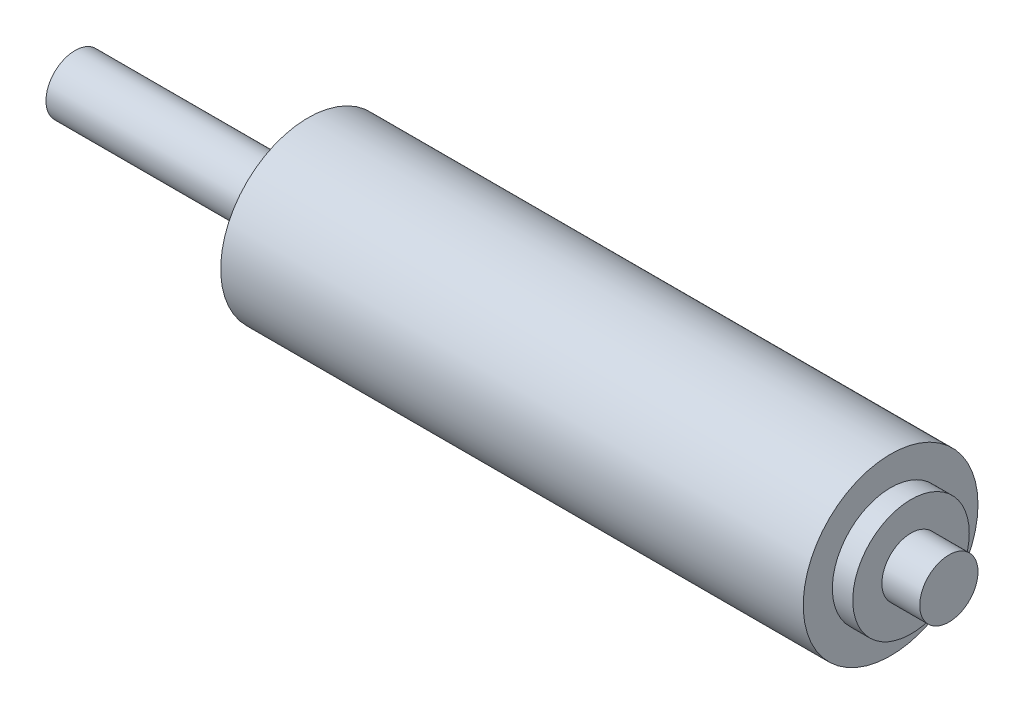
ISO-10303-21;
HEADER;
FILE_DESCRIPTION(('STEP AP214'),'2;1');
FILE_NAME('part.step','',(''),(''),'','','');
FILE_SCHEMA(('AUTOMOTIVE_DESIGN { 1 0 10303 214 1 1 1 1 }'));
ENDSEC;
DATA;
#1=APPLICATION_CONTEXT('core data for automotive mechanical design processes');
#2=APPLICATION_PROTOCOL_DEFINITION('international standard','automotive_design',2000,#1);
#3=PRODUCT_CONTEXT('',#1,'mechanical');
#4=PRODUCT('Part','Part','',(#3));
#5=PRODUCT_RELATED_PRODUCT_CATEGORY('part','',(#4));
#6=PRODUCT_DEFINITION_FORMATION('','',#4);
#7=PRODUCT_DEFINITION_CONTEXT('part definition',#1,'design');
#8=PRODUCT_DEFINITION('design','',#6,#7);
#9=PRODUCT_DEFINITION_SHAPE('','',#8);
#10=(LENGTH_UNIT() NAMED_UNIT(*) SI_UNIT(.MILLI.,.METRE.));
#11=(NAMED_UNIT(*) PLANE_ANGLE_UNIT() SI_UNIT($,.RADIAN.));
#12=(NAMED_UNIT(*) SI_UNIT($,.STERADIAN.) SOLID_ANGLE_UNIT());
#13=UNCERTAINTY_MEASURE_WITH_UNIT(LENGTH_MEASURE(1.E-05),#10,'distance_accuracy_value','');
#14=(GEOMETRIC_REPRESENTATION_CONTEXT(3) GLOBAL_UNCERTAINTY_ASSIGNED_CONTEXT((#13)) GLOBAL_UNIT_ASSIGNED_CONTEXT((#10,
#11,#12)) REPRESENTATION_CONTEXT('',''));
#15=CARTESIAN_POINT('',(0.,0.,0.));
#16=DIRECTION('',(0.,0.,1.));
#17=DIRECTION('',(1.,0.,0.));
#18=AXIS2_PLACEMENT_3D('',#15,#16,#17);
#19=CARTESIAN_POINT('',(0.,0.,0.));
#20=DIRECTION('',(-1.,0.,0.));
#21=DIRECTION('',(0.,0.,1.));
#22=AXIS2_PLACEMENT_3D('',#19,#20,#21);
#23=PLANE('',#22);
#24=CARTESIAN_POINT('',(0.,0.,0.));
#25=DIRECTION('',(1.,0.,0.));
#26=DIRECTION('',(0.,0.,-1.));
#27=AXIS2_PLACEMENT_3D('',#24,#25,#26);
#28=CIRCLE('',#27,5.);
#29=CARTESIAN_POINT('',(0.,0.,-5.));
#30=VERTEX_POINT('',#29);
#31=EDGE_CURVE('E10',#30,#30,#28,.T.);
#32=ORIENTED_EDGE('',*,*,#31,.F.);
#33=EDGE_LOOP('',(#32));
#34=FACE_BOUND('',#33,.T.);
#35=ADVANCED_FACE('F31',(#34),#23,.T.);
#36=CARTESIAN_POINT('',(150.,0.,0.));
#37=DIRECTION('',(1.,0.,0.));
#38=DIRECTION('',(0.,0.,-1.));
#39=AXIS2_PLACEMENT_3D('',#36,#37,#38);
#40=CYLINDRICAL_SURFACE('',#39,5.);
#41=ORIENTED_EDGE('',*,*,#31,.T.);
#42=EDGE_LOOP('',(#41));
#43=FACE_BOUND('',#42,.T.);
#44=CARTESIAN_POINT('',(36.5,0.,0.));
#45=DIRECTION('',(1.,0.,0.));
#46=DIRECTION('',(0.,0.,-1.));
#47=AXIS2_PLACEMENT_3D('',#44,#45,#46);
#48=CIRCLE('',#47,5.);
#49=CARTESIAN_POINT('',(36.5,0.,-5.));
#50=VERTEX_POINT('',#49);
#51=EDGE_CURVE('E37',#50,#50,#48,.T.);
#52=ORIENTED_EDGE('',*,*,#51,.F.);
#53=EDGE_LOOP('',(#52));
#54=FACE_BOUND('',#53,.T.);
#55=ADVANCED_FACE('F85',(#43,#54),#40,.T.);
#56=CARTESIAN_POINT('',(36.5,5.,0.));
#57=DIRECTION('',(-1.,0.,0.));
#58=DIRECTION('',(0.,0.,1.));
#59=AXIS2_PLACEMENT_3D('',#56,#57,#58);
#60=PLANE('',#59);
#61=ORIENTED_EDGE('',*,*,#51,.T.);
#62=EDGE_LOOP('',(#61));
#63=FACE_BOUND('',#62,.T.);
#64=CARTESIAN_POINT('',(36.5,0.,0.));
#65=DIRECTION('',(1.,0.,0.));
#66=DIRECTION('',(0.,0.,-1.));
#67=AXIS2_PLACEMENT_3D('',#64,#65,#66);
#68=CIRCLE('',#67,10.);
#69=CARTESIAN_POINT('',(36.5,0.,-10.));
#70=VERTEX_POINT('',#69);
#71=EDGE_CURVE('E41',#70,#70,#68,.T.);
#72=ORIENTED_EDGE('',*,*,#71,.F.);
#73=EDGE_LOOP('',(#72));
#74=FACE_BOUND('',#73,.T.);
#75=ADVANCED_FACE('F90',(#63,#74),#60,.T.);
#76=CARTESIAN_POINT('',(150.,0.,0.));
#77=DIRECTION('',(1.,0.,0.));
#78=DIRECTION('',(0.,0.,-1.));
#79=AXIS2_PLACEMENT_3D('',#76,#77,#78);
#80=CYLINDRICAL_SURFACE('',#79,10.);
#81=ORIENTED_EDGE('',*,*,#71,.T.);
#82=EDGE_LOOP('',(#81));
#83=FACE_BOUND('',#82,.T.);
#84=CARTESIAN_POINT('',(40.,0.,0.));
#85=DIRECTION('',(1.,0.,0.));
#86=DIRECTION('',(0.,0.,-1.));
#87=AXIS2_PLACEMENT_3D('',#84,#85,#86);
#88=CIRCLE('',#87,10.);
#89=CARTESIAN_POINT('',(40.,0.,-10.));
#90=VERTEX_POINT('',#89);
#91=EDGE_CURVE('E45',#90,#90,#88,.T.);
#92=ORIENTED_EDGE('',*,*,#91,.F.);
#93=EDGE_LOOP('',(#92));
#94=FACE_BOUND('',#93,.T.);
#95=ADVANCED_FACE('F94',(#83,#94),#80,.T.);
#96=CARTESIAN_POINT('',(40.,10.,0.));
#97=DIRECTION('',(-1.,0.,0.));
#98=DIRECTION('',(0.,0.,1.));
#99=AXIS2_PLACEMENT_3D('',#96,#97,#98);
#100=PLANE('',#99);
#101=ORIENTED_EDGE('',*,*,#91,.T.);
#102=EDGE_LOOP('',(#101));
#103=FACE_BOUND('',#102,.T.);
#104=CARTESIAN_POINT('',(40.,0.,0.));
#105=DIRECTION('',(1.,0.,0.));
#106=DIRECTION('',(0.,0.,-1.));
#107=AXIS2_PLACEMENT_3D('',#104,#105,#106);
#108=CIRCLE('',#107,15.);
#109=CARTESIAN_POINT('',(40.,0.,-15.));
#110=VERTEX_POINT('',#109);
#111=EDGE_CURVE('E50',#110,#110,#108,.T.);
#112=ORIENTED_EDGE('',*,*,#111,.F.);
#113=EDGE_LOOP('',(#112));
#114=FACE_BOUND('',#113,.T.);
#115=ADVANCED_FACE('F100',(#103,#114),#100,.T.);
#116=CARTESIAN_POINT('',(150.,0.,0.));
#117=DIRECTION('',(1.,0.,0.));
#118=DIRECTION('',(0.,0.,-1.));
#119=AXIS2_PLACEMENT_3D('',#116,#117,#118);
#120=CYLINDRICAL_SURFACE('',#119,15.);
#121=ORIENTED_EDGE('',*,*,#111,.T.);
#122=EDGE_LOOP('',(#121));
#123=FACE_BOUND('',#122,.T.);
#124=CARTESIAN_POINT('',(140.,0.,0.));
#125=DIRECTION('',(1.,0.,0.));
#126=DIRECTION('',(0.,0.,-1.));
#127=AXIS2_PLACEMENT_3D('',#124,#125,#126);
#128=CIRCLE('',#127,15.);
#129=CARTESIAN_POINT('',(140.,0.,-15.));
#130=VERTEX_POINT('',#129);
#131=EDGE_CURVE('E53',#130,#130,#128,.T.);
#132=ORIENTED_EDGE('',*,*,#131,.F.);
#133=EDGE_LOOP('',(#132));
#134=FACE_BOUND('',#133,.T.);
#135=ADVANCED_FACE('F104',(#123,#134),#120,.T.);
#136=CARTESIAN_POINT('',(140.,15.,0.));
#137=DIRECTION('',(1.,0.,0.));
#138=DIRECTION('',(0.,0.,-1.));
#139=AXIS2_PLACEMENT_3D('',#136,#137,#138);
#140=PLANE('',#139);
#141=ORIENTED_EDGE('',*,*,#131,.T.);
#142=EDGE_LOOP('',(#141));
#143=FACE_BOUND('',#142,.T.);
#144=CARTESIAN_POINT('',(140.,0.,0.));
#145=DIRECTION('',(1.,0.,0.));
#146=DIRECTION('',(0.,0.,-1.));
#147=AXIS2_PLACEMENT_3D('',#144,#145,#146);
#148=CIRCLE('',#147,10.);
#149=CARTESIAN_POINT('',(140.,0.,-10.));
#150=VERTEX_POINT('',#149);
#151=EDGE_CURVE('E56',#150,#150,#148,.T.);
#152=ORIENTED_EDGE('',*,*,#151,.F.);
#153=EDGE_LOOP('',(#152));
#154=FACE_BOUND('',#153,.T.);
#155=ADVANCED_FACE('F108',(#143,#154),#140,.T.);
#156=CARTESIAN_POINT('',(150.,0.,0.));
#157=DIRECTION('',(1.,0.,0.));
#158=DIRECTION('',(0.,0.,-1.));
#159=AXIS2_PLACEMENT_3D('',#156,#157,#158);
#160=CYLINDRICAL_SURFACE('',#159,10.);
#161=ORIENTED_EDGE('',*,*,#151,.T.);
#162=EDGE_LOOP('',(#161));
#163=FACE_BOUND('',#162,.T.);
#164=CARTESIAN_POINT('',(143.5,0.,0.));
#165=DIRECTION('',(1.,0.,0.));
#166=DIRECTION('',(0.,0.,-1.));
#167=AXIS2_PLACEMENT_3D('',#164,#165,#166);
#168=CIRCLE('',#167,10.);
#169=CARTESIAN_POINT('',(143.5,0.,-10.));
#170=VERTEX_POINT('',#169);
#171=EDGE_CURVE('E59',#170,#170,#168,.T.);
#172=ORIENTED_EDGE('',*,*,#171,.F.);
#173=EDGE_LOOP('',(#172));
#174=FACE_BOUND('',#173,.T.);
#175=ADVANCED_FACE('F81',(#163,#174),#160,.T.);
#176=CARTESIAN_POINT('',(143.5,10.,0.));
#177=DIRECTION('',(1.,0.,0.));
#178=DIRECTION('',(0.,0.,-1.));
#179=AXIS2_PLACEMENT_3D('',#176,#177,#178);
#180=PLANE('',#179);
#181=ORIENTED_EDGE('',*,*,#171,.T.);
#182=EDGE_LOOP('',(#181));
#183=FACE_BOUND('',#182,.T.);
#184=CARTESIAN_POINT('',(143.5,0.,0.));
#185=DIRECTION('',(1.,0.,0.));
#186=DIRECTION('',(0.,0.,-1.));
#187=AXIS2_PLACEMENT_3D('',#184,#185,#186);
#188=CIRCLE('',#187,5.);
#189=CARTESIAN_POINT('',(143.5,0.,-5.));
#190=VERTEX_POINT('',#189);
#191=EDGE_CURVE('E62',#190,#190,#188,.T.);
#192=ORIENTED_EDGE('',*,*,#191,.F.);
#193=EDGE_LOOP('',(#192));
#194=FACE_BOUND('',#193,.T.);
#195=ADVANCED_FACE('F73',(#183,#194),#180,.T.);
#196=CARTESIAN_POINT('',(150.,0.,0.));
#197=DIRECTION('',(1.,0.,0.));
#198=DIRECTION('',(0.,0.,-1.));
#199=AXIS2_PLACEMENT_3D('',#196,#197,#198);
#200=CYLINDRICAL_SURFACE('',#199,5.);
#201=ORIENTED_EDGE('',*,*,#191,.T.);
#202=EDGE_LOOP('',(#201));
#203=FACE_BOUND('',#202,.T.);
#204=CARTESIAN_POINT('',(150.,0.,0.));
#205=DIRECTION('',(1.,0.,0.));
#206=DIRECTION('',(0.,0.,-1.));
#207=AXIS2_PLACEMENT_3D('',#204,#205,#206);
#208=CIRCLE('',#207,5.);
#209=CARTESIAN_POINT('',(150.,0.,-5.));
#210=VERTEX_POINT('',#209);
#211=EDGE_CURVE('E65',#210,#210,#208,.T.);
#212=ORIENTED_EDGE('',*,*,#211,.F.);
#213=EDGE_LOOP('',(#212));
#214=FACE_BOUND('',#213,.T.);
#215=ADVANCED_FACE('F71',(#203,#214),#200,.T.);
#216=CARTESIAN_POINT('',(150.,5.,0.));
#217=DIRECTION('',(1.,0.,0.));
#218=DIRECTION('',(0.,0.,-1.));
#219=AXIS2_PLACEMENT_3D('',#216,#217,#218);
#220=PLANE('',#219);
#221=ORIENTED_EDGE('',*,*,#211,.T.);
#222=EDGE_LOOP('',(#221));
#223=FACE_BOUND('',#222,.T.);
#224=ADVANCED_FACE('F69',(#223),#220,.T.);
#225=CLOSED_SHELL('',(#35,#55,#75,#95,#115,#135,#155,#175,#195,#215,#224));
#226=MANIFOLD_SOLID_BREP('B2',#225);
#227=ADVANCED_BREP_SHAPE_REPRESENTATION('',(#18,#226),#14);
#228=SHAPE_DEFINITION_REPRESENTATION(#9,#227);
ENDSEC;
END-ISO-10303-21;
